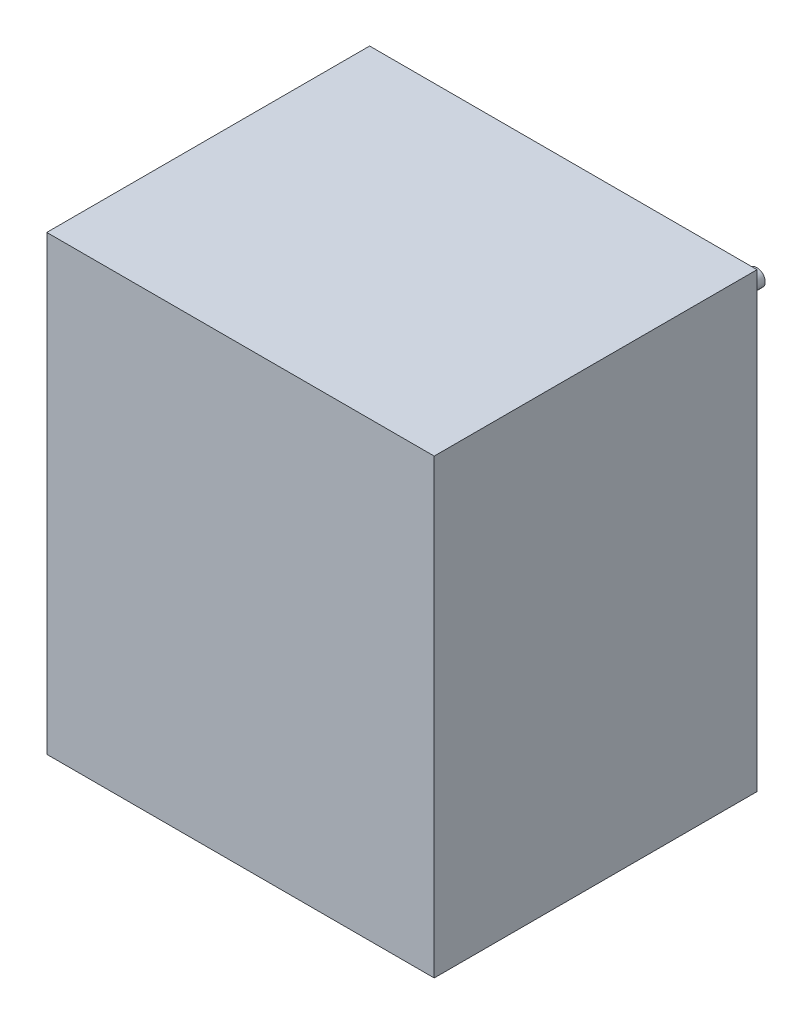
ISO-10303-21;
HEADER;
FILE_DESCRIPTION(('STEP AP214'),'2;1');
FILE_NAME('part.step','',(''),(''),'','','');
FILE_SCHEMA(('AUTOMOTIVE_DESIGN { 1 0 10303 214 1 1 1 1 }'));
ENDSEC;
DATA;
#1=APPLICATION_CONTEXT('core data for automotive mechanical design processes');
#2=APPLICATION_PROTOCOL_DEFINITION('international standard','automotive_design',2000,#1);
#3=PRODUCT_CONTEXT('',#1,'mechanical');
#4=PRODUCT('Part','Part','',(#3));
#5=PRODUCT_RELATED_PRODUCT_CATEGORY('part','',(#4));
#6=PRODUCT_DEFINITION_FORMATION('','',#4);
#7=PRODUCT_DEFINITION_CONTEXT('part definition',#1,'design');
#8=PRODUCT_DEFINITION('design','',#6,#7);
#9=PRODUCT_DEFINITION_SHAPE('','',#8);
#10=(LENGTH_UNIT() NAMED_UNIT(*) SI_UNIT(.MILLI.,.METRE.));
#11=(NAMED_UNIT(*) PLANE_ANGLE_UNIT() SI_UNIT($,.RADIAN.));
#12=(NAMED_UNIT(*) SI_UNIT($,.STERADIAN.) SOLID_ANGLE_UNIT());
#13=UNCERTAINTY_MEASURE_WITH_UNIT(LENGTH_MEASURE(1.E-05),#10,'distance_accuracy_value','');
#14=(GEOMETRIC_REPRESENTATION_CONTEXT(3) GLOBAL_UNCERTAINTY_ASSIGNED_CONTEXT((#13)) GLOBAL_UNIT_ASSIGNED_CONTEXT((#10,
#11,#12)) REPRESENTATION_CONTEXT('',''));
#15=CARTESIAN_POINT('',(0.,0.,0.));
#16=DIRECTION('',(0.,0.,1.));
#17=DIRECTION('',(1.,0.,0.));
#18=AXIS2_PLACEMENT_3D('',#15,#16,#17);
#19=CARTESIAN_POINT('',(0.,0.,500.));
#20=DIRECTION('',(1.,0.,0.));
#21=DIRECTION('',(0.,0.,-1.));
#22=AXIS2_PLACEMENT_3D('',#19,#20,#21);
#23=PLANE('',#22);
#24=CARTESIAN_POINT('',(0.,30.,40.));
#25=DIRECTION('',(1.,0.,0.));
#26=DIRECTION('',(0.,0.,-1.));
#27=AXIS2_PLACEMENT_3D('',#24,#25,#26);
#28=CIRCLE('',#27,12.7);
#29=CARTESIAN_POINT('',(0.,30.,27.3));
#30=VERTEX_POINT('',#29);
#31=EDGE_CURVE('E11',#30,#30,#28,.F.);
#32=ORIENTED_EDGE('',*,*,#31,.F.);
#33=EDGE_LOOP('',(#32));
#34=FACE_BOUND('',#33,.T.);
#35=DIRECTION('',(0.,-1.,0.));
#36=VECTOR('',#35,1.);
#37=CARTESIAN_POINT('',(0.,0.,0.));
#38=LINE('',#37,#36);
#39=CARTESIAN_POINT('',(0.,700.,0.));
#40=VERTEX_POINT('',#39);
#41=CARTESIAN_POINT('',(0.,0.,0.));
#42=VERTEX_POINT('',#41);
#43=EDGE_CURVE('E91',#40,#42,#38,.T.);
#44=ORIENTED_EDGE('',*,*,#43,.T.);
#45=DIRECTION('',(0.,0.,-1.));
#46=VECTOR('',#45,1.);
#47=CARTESIAN_POINT('',(0.,0.,500.));
#48=LINE('',#47,#46);
#49=CARTESIAN_POINT('',(0.,0.,500.));
#50=VERTEX_POINT('',#49);
#51=EDGE_CURVE('E43',#50,#42,#48,.T.);
#52=ORIENTED_EDGE('',*,*,#51,.F.);
#53=DIRECTION('',(0.,-1.,0.));
#54=VECTOR('',#53,1.);
#55=CARTESIAN_POINT('',(0.,0.,500.));
#56=LINE('',#55,#54);
#57=CARTESIAN_POINT('',(0.,700.,500.));
#58=VERTEX_POINT('',#57);
#59=EDGE_CURVE('E102',#58,#50,#56,.T.);
#60=ORIENTED_EDGE('',*,*,#59,.F.);
#61=DIRECTION('',(0.,0.,-1.));
#62=VECTOR('',#61,1.);
#63=CARTESIAN_POINT('',(0.,700.,500.));
#64=LINE('',#63,#62);
#65=EDGE_CURVE('E107',#58,#40,#64,.T.);
#66=ORIENTED_EDGE('',*,*,#65,.T.);
#67=EDGE_LOOP('',(#44,#52,#60,#66));
#68=FACE_BOUND('',#67,.T.);
#69=ADVANCED_FACE('F35',(#34,#68),#23,.F.);
#70=CARTESIAN_POINT('',(0.,0.,500.));
#71=DIRECTION('',(0.,1.,0.));
#72=DIRECTION('',(0.,0.,1.));
#73=AXIS2_PLACEMENT_3D('',#70,#71,#72);
#74=PLANE('',#73);
#75=DIRECTION('',(1.,0.,0.));
#76=VECTOR('',#75,1.);
#77=CARTESIAN_POINT('',(0.,0.,0.));
#78=LINE('',#77,#76);
#79=CARTESIAN_POINT('',(600.,0.,0.));
#80=VERTEX_POINT('',#79);
#81=EDGE_CURVE('E95',#42,#80,#78,.T.);
#82=ORIENTED_EDGE('',*,*,#81,.T.);
#83=DIRECTION('',(0.,0.,-1.));
#84=VECTOR('',#83,1.);
#85=CARTESIAN_POINT('',(600.,0.,500.));
#86=LINE('',#85,#84);
#87=CARTESIAN_POINT('',(600.,0.,500.));
#88=VERTEX_POINT('',#87);
#89=EDGE_CURVE('E115',#88,#80,#86,.T.);
#90=ORIENTED_EDGE('',*,*,#89,.F.);
#91=DIRECTION('',(1.,0.,0.));
#92=VECTOR('',#91,1.);
#93=CARTESIAN_POINT('',(0.,0.,500.));
#94=LINE('',#93,#92);
#95=EDGE_CURVE('E83',#50,#88,#94,.T.);
#96=ORIENTED_EDGE('',*,*,#95,.F.);
#97=ORIENTED_EDGE('',*,*,#51,.T.);
#98=EDGE_LOOP('',(#82,#90,#96,#97));
#99=FACE_BOUND('',#98,.T.);
#100=ADVANCED_FACE('F117',(#99),#74,.F.);
#101=CARTESIAN_POINT('',(600.,0.,500.));
#102=DIRECTION('',(-1.,0.,0.));
#103=DIRECTION('',(0.,0.,1.));
#104=AXIS2_PLACEMENT_3D('',#101,#102,#103);
#105=PLANE('',#104);
#106=DIRECTION('',(0.,1.,0.));
#107=VECTOR('',#106,1.);
#108=CARTESIAN_POINT('',(600.,0.,0.));
#109=LINE('',#108,#107);
#110=CARTESIAN_POINT('',(600.,700.,0.));
#111=VERTEX_POINT('',#110);
#112=EDGE_CURVE('E69',#80,#111,#109,.T.);
#113=ORIENTED_EDGE('',*,*,#112,.T.);
#114=DIRECTION('',(0.,0.,-1.));
#115=VECTOR('',#114,1.);
#116=CARTESIAN_POINT('',(600.,700.,500.));
#117=LINE('',#116,#115);
#118=CARTESIAN_POINT('',(600.,700.,500.));
#119=VERTEX_POINT('',#118);
#120=EDGE_CURVE('E113',#119,#111,#117,.T.);
#121=ORIENTED_EDGE('',*,*,#120,.F.);
#122=DIRECTION('',(0.,1.,0.));
#123=VECTOR('',#122,1.);
#124=CARTESIAN_POINT('',(600.,0.,500.));
#125=LINE('',#124,#123);
#126=EDGE_CURVE('E105',#88,#119,#125,.T.);
#127=ORIENTED_EDGE('',*,*,#126,.F.);
#128=ORIENTED_EDGE('',*,*,#89,.T.);
#129=EDGE_LOOP('',(#113,#121,#127,#128));
#130=FACE_BOUND('',#129,.T.);
#131=ADVANCED_FACE('F142',(#130),#105,.F.);
#132=CARTESIAN_POINT('',(0.,700.,500.));
#133=DIRECTION('',(0.,-1.,0.));
#134=DIRECTION('',(0.,0.,-1.));
#135=AXIS2_PLACEMENT_3D('',#132,#133,#134);
#136=PLANE('',#135);
#137=DIRECTION('',(-1.,0.,0.));
#138=VECTOR('',#137,1.);
#139=CARTESIAN_POINT('',(0.,700.,0.));
#140=LINE('',#139,#138);
#141=EDGE_CURVE('E75',#111,#40,#140,.T.);
#142=ORIENTED_EDGE('',*,*,#141,.T.);
#143=ORIENTED_EDGE('',*,*,#65,.F.);
#144=DIRECTION('',(-1.,0.,0.));
#145=VECTOR('',#144,1.);
#146=CARTESIAN_POINT('',(0.,700.,500.));
#147=LINE('',#146,#145);
#148=EDGE_CURVE('E51',#119,#58,#147,.T.);
#149=ORIENTED_EDGE('',*,*,#148,.F.);
#150=ORIENTED_EDGE('',*,*,#120,.T.);
#151=EDGE_LOOP('',(#142,#143,#149,#150));
#152=FACE_BOUND('',#151,.T.);
#153=ADVANCED_FACE('F134',(#152),#136,.F.);
#154=CARTESIAN_POINT('',(0.,0.,500.));
#155=DIRECTION('',(0.,0.,-1.));
#156=DIRECTION('',(-1.,0.,0.));
#157=AXIS2_PLACEMENT_3D('',#154,#155,#156);
#158=PLANE('',#157);
#159=ORIENTED_EDGE('',*,*,#59,.T.);
#160=ORIENTED_EDGE('',*,*,#95,.T.);
#161=ORIENTED_EDGE('',*,*,#126,.T.);
#162=ORIENTED_EDGE('',*,*,#148,.T.);
#163=EDGE_LOOP('',(#159,#160,#161,#162));
#164=FACE_BOUND('',#163,.T.);
#165=ADVANCED_FACE('F125',(#164),#158,.F.);
#166=CARTESIAN_POINT('',(0.,0.,0.));
#167=DIRECTION('',(0.,0.,-1.));
#168=DIRECTION('',(-1.,0.,0.));
#169=AXIS2_PLACEMENT_3D('',#166,#167,#168);
#170=PLANE('',#169);
#171=ORIENTED_EDGE('',*,*,#43,.F.);
#172=ORIENTED_EDGE('',*,*,#141,.F.);
#173=ORIENTED_EDGE('',*,*,#112,.F.);
#174=ORIENTED_EDGE('',*,*,#81,.F.);
#175=EDGE_LOOP('',(#171,#172,#173,#174));
#176=FACE_BOUND('',#175,.T.);
#177=ADVANCED_FACE('F122',(#176),#170,.T.);
#178=CARTESIAN_POINT('',(-10.,30.,40.));
#179=DIRECTION('',(1.,0.,0.));
#180=DIRECTION('',(0.,0.,-1.));
#181=AXIS2_PLACEMENT_3D('',#178,#179,#180);
#182=CYLINDRICAL_SURFACE('',#181,12.7);
#183=ORIENTED_EDGE('',*,*,#31,.T.);
#184=EDGE_LOOP('',(#183));
#185=FACE_BOUND('',#184,.T.);
#186=CARTESIAN_POINT('',(-40.,30.,40.));
#187=DIRECTION('',(-1.,0.,0.));
#188=DIRECTION('',(0.,0.,1.));
#189=AXIS2_PLACEMENT_3D('',#186,#187,#188);
#190=CIRCLE('',#189,12.7);
#191=CARTESIAN_POINT('',(-40.,30.,52.7));
#192=VERTEX_POINT('',#191);
#193=EDGE_CURVE('E98',#192,#192,#190,.T.);
#194=ORIENTED_EDGE('',*,*,#193,.F.);
#195=EDGE_LOOP('',(#194));
#196=FACE_BOUND('',#195,.T.);
#197=ADVANCED_FACE('F124',(#185,#196),#182,.T.);
#198=CARTESIAN_POINT('',(-60.,30.,-660.));
#199=DIRECTION('',(0.,0.,-1.));
#200=DIRECTION('',(-1.,0.,0.));
#201=AXIS2_PLACEMENT_3D('',#198,#199,#200);
#202=PLANE('',#201);
#203=CARTESIAN_POINT('',(-60.,30.,-660.));
#204=DIRECTION('',(0.,0.,-1.));
#205=DIRECTION('',(-1.,0.,0.));
#206=AXIS2_PLACEMENT_3D('',#203,#204,#205);
#207=CIRCLE('',#206,12.7);
#208=CARTESIAN_POINT('',(-72.7,30.,-660.));
#209=VERTEX_POINT('',#208);
#210=EDGE_CURVE('E88',#209,#209,#207,.T.);
#211=ORIENTED_EDGE('',*,*,#210,.T.);
#212=EDGE_LOOP('',(#211));
#213=FACE_BOUND('',#212,.T.);
#214=ADVANCED_FACE('F89',(#213),#202,.T.);
#215=CARTESIAN_POINT('',(-40.,30.,20.));
#216=DIRECTION('',(0.,-1.,0.));
#217=DIRECTION('',(0.,0.,-1.));
#218=AXIS2_PLACEMENT_3D('',#215,#216,#217);
#219=TOROIDAL_SURFACE('',#218,20.,12.7);
#220=CARTESIAN_POINT('',(-60.,30.,20.));
#221=DIRECTION('',(0.,0.,-1.));
#222=DIRECTION('',(-1.,0.,0.));
#223=AXIS2_PLACEMENT_3D('',#220,#221,#222);
#224=CIRCLE('',#223,12.7);
#225=CARTESIAN_POINT('',(-72.7,30.,20.));
#226=VERTEX_POINT('',#225);
#227=EDGE_CURVE('E92',#226,#226,#224,.T.);
#228=CARTESIAN_POINT('',(-40.,30.,20.));
#229=DIRECTION('',(0.,-1.,0.));
#230=DIRECTION('',(0.,0.,-1.));
#231=AXIS2_PLACEMENT_3D('',#228,#229,#230);
#232=CIRCLE('',#231,32.7);
#233=EDGE_CURVE('',#192,#226,#232,.T.);
#234=ORIENTED_EDGE('',*,*,#193,.T.);
#235=ORIENTED_EDGE('',*,*,#227,.F.);
#236=ORIENTED_EDGE('',*,*,#233,.T.);
#237=ORIENTED_EDGE('',*,*,#233,.F.);
#238=EDGE_LOOP('',(#234,#236,#235,#237));
#239=FACE_BOUND('',#238,.T.);
#240=ADVANCED_FACE('F148',(#239),#219,.T.);
#241=CARTESIAN_POINT('',(-60.,30.,20.));
#242=DIRECTION('',(0.,0.,-1.));
#243=DIRECTION('',(-1.,0.,0.));
#244=AXIS2_PLACEMENT_3D('',#241,#242,#243);
#245=CYLINDRICAL_SURFACE('',#244,12.7);
#246=ORIENTED_EDGE('',*,*,#210,.F.);
#247=EDGE_LOOP('',(#246));
#248=FACE_BOUND('',#247,.T.);
#249=ORIENTED_EDGE('',*,*,#227,.T.);
#250=EDGE_LOOP('',(#249));
#251=FACE_BOUND('',#250,.T.);
#252=ADVANCED_FACE('F133',(#248,#251),#245,.T.);
#253=CLOSED_SHELL('',(#69,#100,#131,#153,#165,#177,#197,#214,#240,#252));
#254=MANIFOLD_SOLID_BREP('B2',#253);
#255=ADVANCED_BREP_SHAPE_REPRESENTATION('',(#18,#254),#14);
#256=SHAPE_DEFINITION_REPRESENTATION(#9,#255);
ENDSEC;
END-ISO-10303-21;
